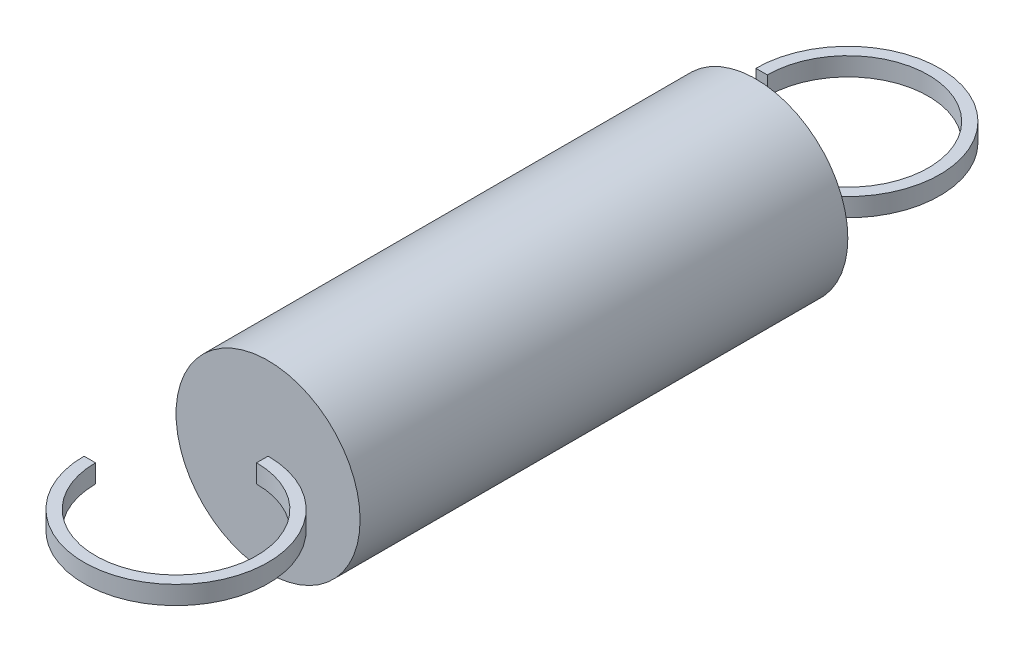
ISO-10303-21;
HEADER;
FILE_DESCRIPTION(('STEP AP214'),'2;1');
FILE_NAME('part.step','',(''),(''),'','','');
FILE_SCHEMA(('AUTOMOTIVE_DESIGN { 1 0 10303 214 1 1 1 1 }'));
ENDSEC;
DATA;
#1=APPLICATION_CONTEXT('core data for automotive mechanical design processes');
#2=APPLICATION_PROTOCOL_DEFINITION('international standard','automotive_design',2000,#1);
#3=PRODUCT_CONTEXT('',#1,'mechanical');
#4=PRODUCT('Part','Part','',(#3));
#5=PRODUCT_RELATED_PRODUCT_CATEGORY('part','',(#4));
#6=PRODUCT_DEFINITION_FORMATION('','',#4);
#7=PRODUCT_DEFINITION_CONTEXT('part definition',#1,'design');
#8=PRODUCT_DEFINITION('design','',#6,#7);
#9=PRODUCT_DEFINITION_SHAPE('','',#8);
#10=(LENGTH_UNIT() NAMED_UNIT(*) SI_UNIT(.MILLI.,.METRE.));
#11=(NAMED_UNIT(*) PLANE_ANGLE_UNIT() SI_UNIT($,.RADIAN.));
#12=(NAMED_UNIT(*) SI_UNIT($,.STERADIAN.) SOLID_ANGLE_UNIT());
#13=UNCERTAINTY_MEASURE_WITH_UNIT(LENGTH_MEASURE(1.E-05),#10,'distance_accuracy_value','');
#14=(GEOMETRIC_REPRESENTATION_CONTEXT(3) GLOBAL_UNCERTAINTY_ASSIGNED_CONTEXT((#13)) GLOBAL_UNIT_ASSIGNED_CONTEXT((#10,
#11,#12)) REPRESENTATION_CONTEXT('',''));
#15=CARTESIAN_POINT('',(0.,0.,0.));
#16=DIRECTION('',(0.,0.,1.));
#17=DIRECTION('',(1.,0.,0.));
#18=AXIS2_PLACEMENT_3D('',#15,#16,#17);
#19=CARTESIAN_POINT('',(0.,-1.,-10.));
#20=DIRECTION('',(0.,1.,0.));
#21=DIRECTION('',(0.,0.,1.));
#22=AXIS2_PLACEMENT_3D('',#19,#20,#21);
#23=CYLINDRICAL_SURFACE('',#22,8.75);
#24=DIRECTION('',(0.,1.,0.));
#25=VECTOR('',#24,1.);
#26=CARTESIAN_POINT('',(0.,-1.,-1.25));
#27=LINE('',#26,#25);
#28=CARTESIAN_POINT('',(0.,-1.,-1.25));
#29=VERTEX_POINT('',#28);
#30=CARTESIAN_POINT('',(0.,1.,-1.25));
#31=VERTEX_POINT('',#30);
#32=EDGE_CURVE('E53',#29,#31,#27,.T.);
#33=ORIENTED_EDGE('',*,*,#32,.T.);
#34=CARTESIAN_POINT('',(0.,1.,-10.));
#35=DIRECTION('',(0.,-1.,0.));
#36=DIRECTION('',(0.,0.,-1.));
#37=AXIS2_PLACEMENT_3D('',#34,#35,#36);
#38=CIRCLE('',#37,8.75);
#39=CARTESIAN_POINT('',(-8.75,1.,-10.));
#40=VERTEX_POINT('',#39);
#41=EDGE_CURVE('E90',#40,#31,#38,.T.);
#42=ORIENTED_EDGE('',*,*,#41,.F.);
#43=DIRECTION('',(0.,1.,0.));
#44=VECTOR('',#43,1.);
#45=CARTESIAN_POINT('',(-8.75,-1.,-10.));
#46=LINE('',#45,#44);
#47=CARTESIAN_POINT('',(-8.75,-1.,-10.));
#48=VERTEX_POINT('',#47);
#49=EDGE_CURVE('E12',#48,#40,#46,.T.);
#50=ORIENTED_EDGE('',*,*,#49,.F.);
#51=CARTESIAN_POINT('',(0.,-1.,-10.));
#52=DIRECTION('',(0.,-1.,0.));
#53=DIRECTION('',(0.,0.,-1.));
#54=AXIS2_PLACEMENT_3D('',#51,#52,#53);
#55=CIRCLE('',#54,8.75);
#56=EDGE_CURVE('E91',#48,#29,#55,.T.);
#57=ORIENTED_EDGE('',*,*,#56,.T.);
#58=EDGE_LOOP('',(#33,#42,#50,#57));
#59=FACE_BOUND('',#58,.T.);
#60=ADVANCED_FACE('F50',(#59),#23,.F.);
#61=CARTESIAN_POINT('',(-10.,-1.,-10.));
#62=DIRECTION('',(0.,0.,1.));
#63=DIRECTION('',(1.,0.,0.));
#64=AXIS2_PLACEMENT_3D('',#61,#62,#63);
#65=PLANE('',#64);
#66=ORIENTED_EDGE('',*,*,#49,.T.);
#67=DIRECTION('',(1.,0.,0.));
#68=VECTOR('',#67,1.);
#69=CARTESIAN_POINT('',(-10.,1.,-10.));
#70=LINE('',#69,#68);
#71=CARTESIAN_POINT('',(-10.,1.,-10.));
#72=VERTEX_POINT('',#71);
#73=EDGE_CURVE('E107',#72,#40,#70,.T.);
#74=ORIENTED_EDGE('',*,*,#73,.F.);
#75=DIRECTION('',(0.,1.,0.));
#76=VECTOR('',#75,1.);
#77=CARTESIAN_POINT('',(-10.,-1.,-10.));
#78=LINE('',#77,#76);
#79=CARTESIAN_POINT('',(-10.,-1.,-10.));
#80=VERTEX_POINT('',#79);
#81=EDGE_CURVE('E58',#80,#72,#78,.T.);
#82=ORIENTED_EDGE('',*,*,#81,.F.);
#83=DIRECTION('',(1.,0.,0.));
#84=VECTOR('',#83,1.);
#85=CARTESIAN_POINT('',(-10.,-1.,-10.));
#86=LINE('',#85,#84);
#87=EDGE_CURVE('E96',#80,#48,#86,.T.);
#88=ORIENTED_EDGE('',*,*,#87,.T.);
#89=EDGE_LOOP('',(#66,#74,#82,#88));
#90=FACE_BOUND('',#89,.T.);
#91=ADVANCED_FACE('F122',(#90),#65,.T.);
#92=CARTESIAN_POINT('',(0.,-1.,-10.));
#93=DIRECTION('',(0.,1.,0.));
#94=DIRECTION('',(0.,0.,1.));
#95=AXIS2_PLACEMENT_3D('',#92,#93,#94);
#96=CYLINDRICAL_SURFACE('',#95,10.);
#97=ORIENTED_EDGE('',*,*,#81,.T.);
#98=CARTESIAN_POINT('',(0.,1.,-10.));
#99=DIRECTION('',(0.,1.,0.));
#100=DIRECTION('',(0.,0.,-1.));
#101=AXIS2_PLACEMENT_3D('',#98,#99,#100);
#102=CIRCLE('',#101,10.);
#103=CARTESIAN_POINT('',(0.,1.,0.));
#104=VERTEX_POINT('',#103);
#105=EDGE_CURVE('E103',#104,#72,#102,.T.);
#106=ORIENTED_EDGE('',*,*,#105,.F.);
#107=DIRECTION('',(0.,1.,0.));
#108=VECTOR('',#107,1.);
#109=CARTESIAN_POINT('',(0.,-1.,0.));
#110=LINE('',#109,#108);
#111=CARTESIAN_POINT('',(0.,-1.,0.));
#112=VERTEX_POINT('',#111);
#113=EDGE_CURVE('E95',#112,#104,#110,.T.);
#114=ORIENTED_EDGE('',*,*,#113,.F.);
#115=CARTESIAN_POINT('',(0.,-1.,-10.));
#116=DIRECTION('',(0.,1.,0.));
#117=DIRECTION('',(0.,0.,-1.));
#118=AXIS2_PLACEMENT_3D('',#115,#116,#117);
#119=CIRCLE('',#118,10.);
#120=EDGE_CURVE('E115',#112,#80,#119,.T.);
#121=ORIENTED_EDGE('',*,*,#120,.T.);
#122=EDGE_LOOP('',(#97,#106,#114,#121));
#123=FACE_BOUND('',#122,.T.);
#124=ADVANCED_FACE('F119',(#123),#96,.T.);
#125=CARTESIAN_POINT('',(0.,-1.,-1.25));
#126=DIRECTION('',(-1.,0.,0.));
#127=DIRECTION('',(0.,0.,1.));
#128=AXIS2_PLACEMENT_3D('',#125,#126,#127);
#129=PLANE('',#128);
#130=ORIENTED_EDGE('',*,*,#113,.T.);
#131=DIRECTION('',(0.,0.,1.));
#132=VECTOR('',#131,1.);
#133=CARTESIAN_POINT('',(0.,1.,-1.25));
#134=LINE('',#133,#132);
#135=EDGE_CURVE('E98',#31,#104,#134,.T.);
#136=ORIENTED_EDGE('',*,*,#135,.F.);
#137=ORIENTED_EDGE('',*,*,#32,.F.);
#138=DIRECTION('',(0.,0.,1.));
#139=VECTOR('',#138,1.);
#140=CARTESIAN_POINT('',(0.,-1.,-1.25));
#141=LINE('',#140,#139);
#142=EDGE_CURVE('E113',#29,#112,#141,.T.);
#143=ORIENTED_EDGE('',*,*,#142,.T.);
#144=EDGE_LOOP('',(#130,#136,#137,#143));
#145=FACE_BOUND('',#144,.T.);
#146=ADVANCED_FACE('F99',(#145),#129,.T.);
#147=CARTESIAN_POINT('',(0.,-1.,-10.));
#148=DIRECTION('',(0.,-1.,0.));
#149=DIRECTION('',(0.,0.,-1.));
#150=AXIS2_PLACEMENT_3D('',#147,#148,#149);
#151=PLANE('',#150);
#152=ORIENTED_EDGE('',*,*,#56,.F.);
#153=ORIENTED_EDGE('',*,*,#87,.F.);
#154=ORIENTED_EDGE('',*,*,#120,.F.);
#155=ORIENTED_EDGE('',*,*,#142,.F.);
#156=EDGE_LOOP('',(#152,#153,#154,#155));
#157=FACE_BOUND('',#156,.T.);
#158=ADVANCED_FACE('F124',(#157),#151,.T.);
#159=CARTESIAN_POINT('',(0.,1.,-10.));
#160=DIRECTION('',(0.,-1.,0.));
#161=DIRECTION('',(0.,0.,-1.));
#162=AXIS2_PLACEMENT_3D('',#159,#160,#161);
#163=PLANE('',#162);
#164=ORIENTED_EDGE('',*,*,#41,.T.);
#165=ORIENTED_EDGE('',*,*,#135,.T.);
#166=ORIENTED_EDGE('',*,*,#105,.T.);
#167=ORIENTED_EDGE('',*,*,#73,.T.);
#168=EDGE_LOOP('',(#164,#165,#166,#167));
#169=FACE_BOUND('',#168,.T.);
#170=ADVANCED_FACE('F106',(#169),#163,.F.);
#171=CLOSED_SHELL('',(#60,#91,#124,#146,#158,#170));
#172=MANIFOLD_SOLID_BREP('B2',#171);
#173=CARTESIAN_POINT('',(0.,-1.,63.));
#174=DIRECTION('',(0.,1.,0.));
#175=DIRECTION('',(0.,0.,1.));
#176=AXIS2_PLACEMENT_3D('',#173,#174,#175);
#177=CYLINDRICAL_SURFACE('',#176,10.);
#178=DIRECTION('',(0.,1.,0.));
#179=VECTOR('',#178,1.);
#180=CARTESIAN_POINT('',(0.,-1.,53.));
#181=LINE('',#180,#179);
#182=CARTESIAN_POINT('',(0.,-1.,53.));
#183=VERTEX_POINT('',#182);
#184=CARTESIAN_POINT('',(0.,1.,53.));
#185=VERTEX_POINT('',#184);
#186=EDGE_CURVE('E184',#183,#185,#181,.T.);
#187=ORIENTED_EDGE('',*,*,#186,.T.);
#188=CARTESIAN_POINT('',(0.,1.,63.));
#189=DIRECTION('',(0.,1.,0.));
#190=DIRECTION('',(0.,0.,1.));
#191=AXIS2_PLACEMENT_3D('',#188,#189,#190);
#192=CIRCLE('',#191,10.);
#193=CARTESIAN_POINT('',(-10.,1.,63.));
#194=VERTEX_POINT('',#193);
#195=EDGE_CURVE('E221',#194,#185,#192,.T.);
#196=ORIENTED_EDGE('',*,*,#195,.F.);
#197=DIRECTION('',(0.,1.,0.));
#198=VECTOR('',#197,1.);
#199=CARTESIAN_POINT('',(-10.,-1.,63.));
#200=LINE('',#199,#198);
#201=CARTESIAN_POINT('',(-10.,-1.,63.));
#202=VERTEX_POINT('',#201);
#203=EDGE_CURVE('E48',#202,#194,#200,.T.);
#204=ORIENTED_EDGE('',*,*,#203,.F.);
#205=CARTESIAN_POINT('',(0.,-1.,63.));
#206=DIRECTION('',(0.,1.,0.));
#207=DIRECTION('',(0.,0.,1.));
#208=AXIS2_PLACEMENT_3D('',#205,#206,#207);
#209=CIRCLE('',#208,10.);
#210=EDGE_CURVE('E222',#202,#183,#209,.T.);
#211=ORIENTED_EDGE('',*,*,#210,.T.);
#212=EDGE_LOOP('',(#187,#196,#204,#211));
#213=FACE_BOUND('',#212,.T.);
#214=ADVANCED_FACE('F181',(#213),#177,.T.);
#215=CARTESIAN_POINT('',(-10.,-1.,63.));
#216=DIRECTION('',(0.,0.,-1.));
#217=DIRECTION('',(-1.,0.,0.));
#218=AXIS2_PLACEMENT_3D('',#215,#216,#217);
#219=PLANE('',#218);
#220=ORIENTED_EDGE('',*,*,#203,.T.);
#221=DIRECTION('',(-1.,0.,0.));
#222=VECTOR('',#221,1.);
#223=CARTESIAN_POINT('',(-10.,1.,63.));
#224=LINE('',#223,#222);
#225=CARTESIAN_POINT('',(-8.75,1.,63.));
#226=VERTEX_POINT('',#225);
#227=EDGE_CURVE('E238',#226,#194,#224,.T.);
#228=ORIENTED_EDGE('',*,*,#227,.F.);
#229=DIRECTION('',(0.,1.,0.));
#230=VECTOR('',#229,1.);
#231=CARTESIAN_POINT('',(-8.75,-1.,63.));
#232=LINE('',#231,#230);
#233=CARTESIAN_POINT('',(-8.75,-1.,63.));
#234=VERTEX_POINT('',#233);
#235=EDGE_CURVE('E189',#234,#226,#232,.T.);
#236=ORIENTED_EDGE('',*,*,#235,.F.);
#237=DIRECTION('',(-1.,0.,0.));
#238=VECTOR('',#237,1.);
#239=CARTESIAN_POINT('',(-10.,-1.,63.));
#240=LINE('',#239,#238);
#241=EDGE_CURVE('E227',#234,#202,#240,.T.);
#242=ORIENTED_EDGE('',*,*,#241,.T.);
#243=EDGE_LOOP('',(#220,#228,#236,#242));
#244=FACE_BOUND('',#243,.T.);
#245=ADVANCED_FACE('F253',(#244),#219,.T.);
#246=CARTESIAN_POINT('',(0.,-1.,63.));
#247=DIRECTION('',(0.,1.,0.));
#248=DIRECTION('',(0.,0.,1.));
#249=AXIS2_PLACEMENT_3D('',#246,#247,#248);
#250=CYLINDRICAL_SURFACE('',#249,8.75);
#251=ORIENTED_EDGE('',*,*,#235,.T.);
#252=CARTESIAN_POINT('',(0.,1.,63.));
#253=DIRECTION('',(0.,-1.,0.));
#254=DIRECTION('',(0.,0.,1.));
#255=AXIS2_PLACEMENT_3D('',#252,#253,#254);
#256=CIRCLE('',#255,8.75);
#257=CARTESIAN_POINT('',(0.,1.,54.25));
#258=VERTEX_POINT('',#257);
#259=EDGE_CURVE('E234',#258,#226,#256,.T.);
#260=ORIENTED_EDGE('',*,*,#259,.F.);
#261=DIRECTION('',(0.,1.,0.));
#262=VECTOR('',#261,1.);
#263=CARTESIAN_POINT('',(0.,-1.,54.25));
#264=LINE('',#263,#262);
#265=CARTESIAN_POINT('',(0.,-1.,54.25));
#266=VERTEX_POINT('',#265);
#267=EDGE_CURVE('E226',#266,#258,#264,.T.);
#268=ORIENTED_EDGE('',*,*,#267,.F.);
#269=CARTESIAN_POINT('',(0.,-1.,63.));
#270=DIRECTION('',(0.,-1.,0.));
#271=DIRECTION('',(0.,0.,1.));
#272=AXIS2_PLACEMENT_3D('',#269,#270,#271);
#273=CIRCLE('',#272,8.75);
#274=EDGE_CURVE('E246',#266,#234,#273,.T.);
#275=ORIENTED_EDGE('',*,*,#274,.T.);
#276=EDGE_LOOP('',(#251,#260,#268,#275));
#277=FACE_BOUND('',#276,.T.);
#278=ADVANCED_FACE('F250',(#277),#250,.F.);
#279=CARTESIAN_POINT('',(0.,-1.,54.25));
#280=DIRECTION('',(-1.,0.,0.));
#281=DIRECTION('',(0.,0.,1.));
#282=AXIS2_PLACEMENT_3D('',#279,#280,#281);
#283=PLANE('',#282);
#284=ORIENTED_EDGE('',*,*,#267,.T.);
#285=DIRECTION('',(0.,0.,1.));
#286=VECTOR('',#285,1.);
#287=CARTESIAN_POINT('',(0.,1.,54.25));
#288=LINE('',#287,#286);
#289=EDGE_CURVE('E229',#185,#258,#288,.T.);
#290=ORIENTED_EDGE('',*,*,#289,.F.);
#291=ORIENTED_EDGE('',*,*,#186,.F.);
#292=DIRECTION('',(0.,0.,1.));
#293=VECTOR('',#292,1.);
#294=CARTESIAN_POINT('',(0.,-1.,54.25));
#295=LINE('',#294,#293);
#296=EDGE_CURVE('E244',#183,#266,#295,.T.);
#297=ORIENTED_EDGE('',*,*,#296,.T.);
#298=EDGE_LOOP('',(#284,#290,#291,#297));
#299=FACE_BOUND('',#298,.T.);
#300=ADVANCED_FACE('F230',(#299),#283,.T.);
#301=CARTESIAN_POINT('',(0.,-1.,63.));
#302=DIRECTION('',(0.,1.,0.));
#303=DIRECTION('',(0.,0.,1.));
#304=AXIS2_PLACEMENT_3D('',#301,#302,#303);
#305=PLANE('',#304);
#306=ORIENTED_EDGE('',*,*,#210,.F.);
#307=ORIENTED_EDGE('',*,*,#241,.F.);
#308=ORIENTED_EDGE('',*,*,#274,.F.);
#309=ORIENTED_EDGE('',*,*,#296,.F.);
#310=EDGE_LOOP('',(#306,#307,#308,#309));
#311=FACE_BOUND('',#310,.T.);
#312=ADVANCED_FACE('F255',(#311),#305,.F.);
#313=CARTESIAN_POINT('',(0.,1.,63.));
#314=DIRECTION('',(0.,1.,0.));
#315=DIRECTION('',(0.,0.,1.));
#316=AXIS2_PLACEMENT_3D('',#313,#314,#315);
#317=PLANE('',#316);
#318=ORIENTED_EDGE('',*,*,#195,.T.);
#319=ORIENTED_EDGE('',*,*,#289,.T.);
#320=ORIENTED_EDGE('',*,*,#259,.T.);
#321=ORIENTED_EDGE('',*,*,#227,.T.);
#322=EDGE_LOOP('',(#318,#319,#320,#321));
#323=FACE_BOUND('',#322,.T.);
#324=ADVANCED_FACE('F237',(#323),#317,.T.);
#325=CLOSED_SHELL('',(#214,#245,#278,#300,#312,#324));
#326=MANIFOLD_SOLID_BREP('B6',#325);
#327=CARTESIAN_POINT('',(0.,0.,53.));
#328=DIRECTION('',(0.,0.,-1.));
#329=DIRECTION('',(-1.,0.,0.));
#330=AXIS2_PLACEMENT_3D('',#327,#328,#329);
#331=CYLINDRICAL_SURFACE('',#330,10.);
#332=CARTESIAN_POINT('',(0.,0.,53.));
#333=DIRECTION('',(0.,0.,1.));
#334=DIRECTION('',(1.,0.,0.));
#335=AXIS2_PLACEMENT_3D('',#332,#333,#334);
#336=CIRCLE('',#335,10.);
#337=CARTESIAN_POINT('',(10.,0.,53.));
#338=VERTEX_POINT('',#337);
#339=EDGE_CURVE('E180',#338,#338,#336,.T.);
#340=ORIENTED_EDGE('',*,*,#339,.F.);
#341=EDGE_LOOP('',(#340));
#342=FACE_BOUND('',#341,.T.);
#343=CARTESIAN_POINT('',(0.,0.,0.));
#344=DIRECTION('',(0.,0.,1.));
#345=DIRECTION('',(1.,0.,0.));
#346=AXIS2_PLACEMENT_3D('',#343,#344,#345);
#347=CIRCLE('',#346,10.);
#348=CARTESIAN_POINT('',(10.,0.,0.));
#349=VERTEX_POINT('',#348);
#350=EDGE_CURVE('E308',#349,#349,#347,.T.);
#351=ORIENTED_EDGE('',*,*,#350,.T.);
#352=EDGE_LOOP('',(#351));
#353=FACE_BOUND('',#352,.T.);
#354=ADVANCED_FACE('F305',(#342,#353),#331,.T.);
#355=CARTESIAN_POINT('',(0.,0.,53.));
#356=DIRECTION('',(0.,0.,1.));
#357=DIRECTION('',(1.,0.,0.));
#358=AXIS2_PLACEMENT_3D('',#355,#356,#357);
#359=PLANE('',#358);
#360=ORIENTED_EDGE('',*,*,#339,.T.);
#361=EDGE_LOOP('',(#360));
#362=FACE_BOUND('',#361,.T.);
#363=ADVANCED_FACE('F322',(#362),#359,.T.);
#364=CARTESIAN_POINT('',(0.,0.,0.));
#365=DIRECTION('',(0.,0.,1.));
#366=DIRECTION('',(1.,0.,0.));
#367=AXIS2_PLACEMENT_3D('',#364,#365,#366);
#368=PLANE('',#367);
#369=ORIENTED_EDGE('',*,*,#350,.F.);
#370=EDGE_LOOP('',(#369));
#371=FACE_BOUND('',#370,.T.);
#372=ADVANCED_FACE('F320',(#371),#368,.F.);
#373=CLOSED_SHELL('',(#354,#363,#372));
#374=MANIFOLD_SOLID_BREP('B42',#373);
#375=ADVANCED_BREP_SHAPE_REPRESENTATION('',(#18,#172,#326,#374),#14);
#376=SHAPE_DEFINITION_REPRESENTATION(#9,#375);
ENDSEC;
END-ISO-10303-21;
